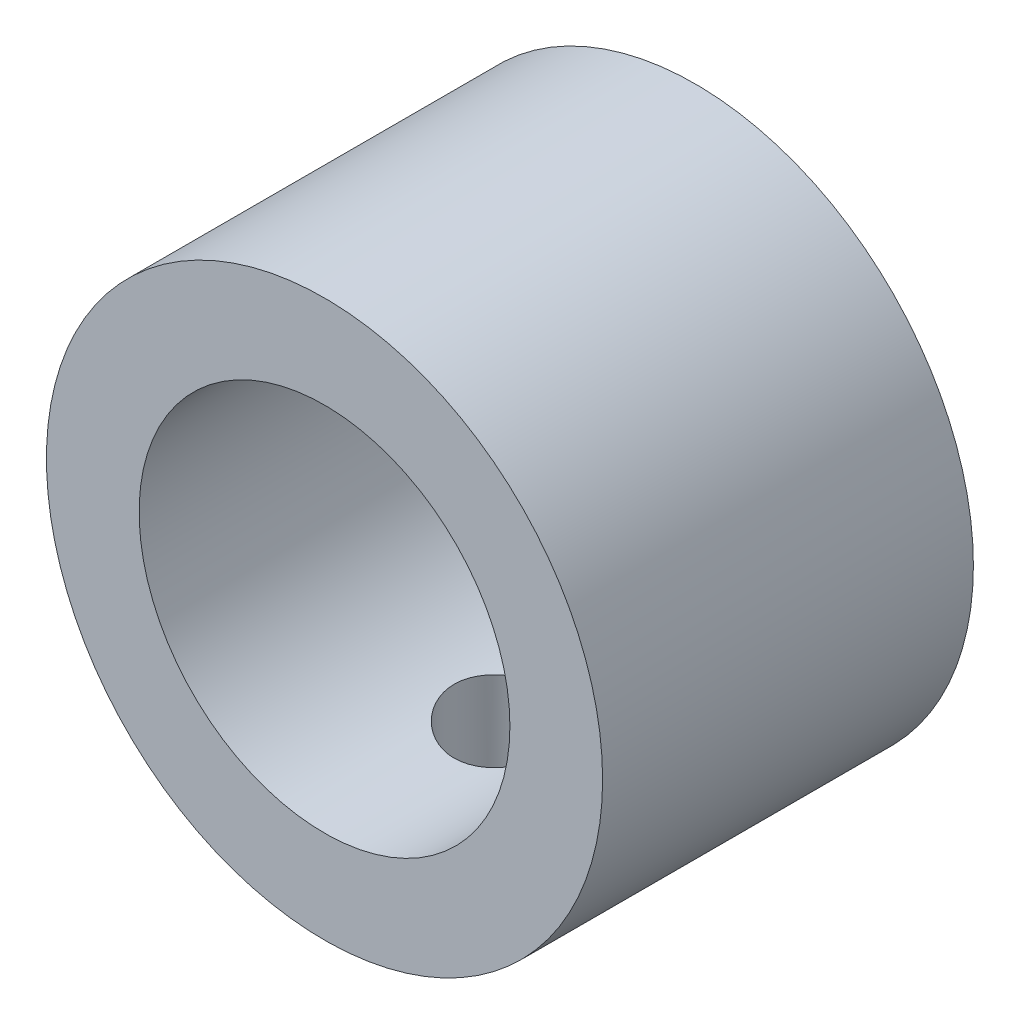
ISO-10303-21;
HEADER;
FILE_DESCRIPTION(('STEP AP214'),'2;1');
FILE_NAME('part.step','',(''),(''),'','','');
FILE_SCHEMA(('AUTOMOTIVE_DESIGN { 1 0 10303 214 1 1 1 1 }'));
ENDSEC;
DATA;
#1=APPLICATION_CONTEXT('core data for automotive mechanical design processes');
#2=APPLICATION_PROTOCOL_DEFINITION('international standard','automotive_design',2000,#1);
#3=PRODUCT_CONTEXT('',#1,'mechanical');
#4=PRODUCT('Part','Part','',(#3));
#5=PRODUCT_RELATED_PRODUCT_CATEGORY('part','',(#4));
#6=PRODUCT_DEFINITION_FORMATION('','',#4);
#7=PRODUCT_DEFINITION_CONTEXT('part definition',#1,'design');
#8=PRODUCT_DEFINITION('design','',#6,#7);
#9=PRODUCT_DEFINITION_SHAPE('','',#8);
#10=(LENGTH_UNIT() NAMED_UNIT(*) SI_UNIT(.MILLI.,.METRE.));
#11=(NAMED_UNIT(*) PLANE_ANGLE_UNIT() SI_UNIT($,.RADIAN.));
#12=(NAMED_UNIT(*) SI_UNIT($,.STERADIAN.) SOLID_ANGLE_UNIT());
#13=UNCERTAINTY_MEASURE_WITH_UNIT(LENGTH_MEASURE(1.E-05),#10,'distance_accuracy_value','');
#14=(GEOMETRIC_REPRESENTATION_CONTEXT(3) GLOBAL_UNCERTAINTY_ASSIGNED_CONTEXT((#13)) GLOBAL_UNIT_ASSIGNED_CONTEXT((#10,
#11,#12)) REPRESENTATION_CONTEXT('',''));
#15=CARTESIAN_POINT('',(0.,0.,0.));
#16=DIRECTION('',(0.,0.,1.));
#17=DIRECTION('',(1.,0.,0.));
#18=AXIS2_PLACEMENT_3D('',#15,#16,#17);
#19=CARTESIAN_POINT('',(0.,0.,5.));
#20=DIRECTION('',(0.,0.,1.));
#21=DIRECTION('',(1.,0.,0.));
#22=AXIS2_PLACEMENT_3D('',#19,#20,#21);
#23=PLANE('',#22);
#24=CARTESIAN_POINT('',(0.,0.,5.));
#25=DIRECTION('',(0.,0.,1.));
#26=DIRECTION('',(1.,0.,0.));
#27=AXIS2_PLACEMENT_3D('',#24,#25,#26);
#28=CIRCLE('',#27,7.5);
#29=CARTESIAN_POINT('',(7.5,0.,5.));
#30=VERTEX_POINT('',#29);
#31=EDGE_CURVE('E10',#30,#30,#28,.T.);
#32=ORIENTED_EDGE('',*,*,#31,.T.);
#33=EDGE_LOOP('',(#32));
#34=FACE_BOUND('',#33,.T.);
#35=CARTESIAN_POINT('',(0.,0.,5.));
#36=DIRECTION('',(0.,0.,1.));
#37=DIRECTION('',(1.,0.,0.));
#38=AXIS2_PLACEMENT_3D('',#35,#36,#37);
#39=CIRCLE('',#38,5.);
#40=CARTESIAN_POINT('',(5.,0.,5.));
#41=VERTEX_POINT('',#40);
#42=EDGE_CURVE('E49',#41,#41,#39,.T.);
#43=ORIENTED_EDGE('',*,*,#42,.F.);
#44=EDGE_LOOP('',(#43));
#45=FACE_BOUND('',#44,.T.);
#46=ADVANCED_FACE('F30',(#34,#45),#23,.T.);
#47=CARTESIAN_POINT('',(0.,0.,-5.));
#48=DIRECTION('',(0.,0.,1.));
#49=DIRECTION('',(1.,0.,0.));
#50=AXIS2_PLACEMENT_3D('',#47,#48,#49);
#51=PLANE('',#50);
#52=CARTESIAN_POINT('',(0.,0.,-5.));
#53=DIRECTION('',(0.,0.,1.));
#54=DIRECTION('',(1.,0.,0.));
#55=AXIS2_PLACEMENT_3D('',#52,#53,#54);
#56=CIRCLE('',#55,7.5);
#57=CARTESIAN_POINT('',(7.5,0.,-5.));
#58=VERTEX_POINT('',#57);
#59=EDGE_CURVE('E44',#58,#58,#56,.T.);
#60=ORIENTED_EDGE('',*,*,#59,.F.);
#61=EDGE_LOOP('',(#60));
#62=FACE_BOUND('',#61,.T.);
#63=CARTESIAN_POINT('',(0.,0.,-5.));
#64=DIRECTION('',(0.,0.,1.));
#65=DIRECTION('',(1.,0.,0.));
#66=AXIS2_PLACEMENT_3D('',#63,#64,#65);
#67=CIRCLE('',#66,5.);
#68=CARTESIAN_POINT('',(5.,0.,-5.));
#69=VERTEX_POINT('',#68);
#70=EDGE_CURVE('E51',#69,#69,#67,.T.);
#71=ORIENTED_EDGE('',*,*,#70,.T.);
#72=EDGE_LOOP('',(#71));
#73=FACE_BOUND('',#72,.T.);
#74=ADVANCED_FACE('F72',(#62,#73),#51,.F.);
#75=CARTESIAN_POINT('',(0.,0.,5.));
#76=DIRECTION('',(0.,0.,-1.));
#77=DIRECTION('',(-1.,0.,0.));
#78=AXIS2_PLACEMENT_3D('',#75,#76,#77);
#79=CYLINDRICAL_SURFACE('',#78,7.5);
#80=CARTESIAN_POINT('',(0.,-7.5,1.5));
#81=CARTESIAN_POINT('',(0.0833653601889498,-7.49999846371307,1.49999693325248));
#82=CARTESIAN_POINT('',(0.166769490302284,-7.49859577767346,1.49302673554853));
#83=CARTESIAN_POINT('',(0.331220261533529,-7.49313548434847,1.46535224982713));
#84=CARTESIAN_POINT('',(0.412264976312034,-7.48907576790279,1.44463705079774));
#85=CARTESIAN_POINT('',(0.569595457894969,-7.4787547391743,1.39013808956882));
#86=CARTESIAN_POINT('',(0.645885701899701,-7.47249553615077,1.35636684473297));
#87=CARTESIAN_POINT('',(0.791711983296338,-7.45845597052971,1.27675162873306));
#88=CARTESIAN_POINT('',(0.861248422613718,-7.4506756985356,1.23090837658919));
#89=CARTESIAN_POINT('',(0.992540215972297,-7.43433247994955,1.12779225856285));
#90=CARTESIAN_POINT('',(1.05419092673779,-7.42576118256521,1.0703874669132));
#91=CARTESIAN_POINT('',(1.16705513491204,-7.40886270678882,0.946061375412447));
#92=CARTESIAN_POINT('',(1.21826781715564,-7.40053554750636,0.879139332997323));
#93=CARTESIAN_POINT('',(1.30924763002143,-7.38498662718923,0.736925710482187));
#94=CARTESIAN_POINT('',(1.3489064082988,-7.37777561047419,0.661563534305461));
#95=CARTESIAN_POINT('',(1.41495849987046,-7.36539402087627,0.505077271493881));
#96=CARTESIAN_POINT('',(1.44135312365586,-7.36022324642942,0.423953754980482));
#97=CARTESIAN_POINT('',(1.47978794982724,-7.35259207878307,0.259373454138124));
#98=CARTESIAN_POINT('',(1.49201174693817,-7.35009705160781,0.175961183786661));
#99=CARTESIAN_POINT('',(1.50232819158918,-7.34799562590941,0.00823526795348636));
#100=CARTESIAN_POINT('',(1.50042228407025,-7.34838893201761,-0.0760782844802178));
#101=CARTESIAN_POINT('',(1.48268185965273,-7.35198826722277,-0.241870182031505));
#102=CARTESIAN_POINT('',(1.46705781036586,-7.35515179288145,-0.323372108440971));
#103=CARTESIAN_POINT('',(1.42265682693458,-7.36386819240002,-0.482574114994503));
#104=CARTESIAN_POINT('',(1.39387926465102,-7.36942118036668,-0.560274013378512));
#105=CARTESIAN_POINT('',(1.32378717551208,-7.38233427750612,-0.710272892555398));
#106=CARTESIAN_POINT('',(1.28238922684817,-7.38970634720557,-0.782531819353757));
#107=CARTESIAN_POINT('',(1.18829036185902,-7.40541928159593,-0.919156274959221));
#108=CARTESIAN_POINT('',(1.13558814653524,-7.41376025757549,-0.983520895276736));
#109=CARTESIAN_POINT('',(1.01924990184088,-7.43065531862193,-1.1037441036854));
#110=CARTESIAN_POINT('',(0.955434241818668,-7.43921053816357,-1.1594288517887));
#111=CARTESIAN_POINT('',(0.819277536093015,-7.45543273071613,-1.25933076945184));
#112=CARTESIAN_POINT('',(0.746936381069084,-7.4630996923346,-1.30354779194037));
#113=CARTESIAN_POINT('',(0.595589080318381,-7.47670035241331,-1.37929126383896));
#114=CARTESIAN_POINT('',(0.51657272937795,-7.48263133272408,-1.41079784046681));
#115=CARTESIAN_POINT('',(0.354223464672997,-7.49207113481787,-1.46004071105785));
#116=CARTESIAN_POINT('',(0.270891075108675,-7.49558025000797,-1.47777867311044));
#117=CARTESIAN_POINT('',(0.103769108440726,-7.49974007800302,-1.49873468069142));
#118=CARTESIAN_POINT('',(0.0200104924883644,-7.50043761978705,-1.5021906293104));
#119=CARTESIAN_POINT('',(-0.146887401289071,-7.49902577895154,-1.49512521158673));
#120=CARTESIAN_POINT('',(-0.23002671366569,-7.49691655412169,-1.48460463097111));
#121=CARTESIAN_POINT('',(-0.392558489919811,-7.49015748012026,-1.45008243968407));
#122=CARTESIAN_POINT('',(-0.471977922509855,-7.4855306460631,-1.42620289725315));
#123=CARTESIAN_POINT('',(-0.625685441249501,-7.47425328091549,-1.36577402601629));
#124=CARTESIAN_POINT('',(-0.699973142456309,-7.4676025982134,-1.32922374798476));
#125=CARTESIAN_POINT('',(-0.842311760529326,-7.45289867299942,-1.24397626402303));
#126=CARTESIAN_POINT('',(-0.910275190128282,-7.44482925655578,-1.19513582844158));
#127=CARTESIAN_POINT('',(-1.03712702867881,-7.42822102244824,-1.08688621318908));
#128=CARTESIAN_POINT('',(-1.09601446339614,-7.41968215452582,-1.0274759004002));
#129=CARTESIAN_POINT('',(-1.20396088616126,-7.40293955335447,-0.898689972163314));
#130=CARTESIAN_POINT('',(-1.25285655367298,-7.39474290349956,-0.829176383667994));
#131=CARTESIAN_POINT('',(-1.33827813007681,-7.37976287694291,-0.682782957964981));
#132=CARTESIAN_POINT('',(-1.37480453388435,-7.37297944370014,-0.605903415639671));
#133=CARTESIAN_POINT('',(-1.43422776237294,-7.36165110876574,-0.447347630775677));
#134=CARTESIAN_POINT('',(-1.45719524968658,-7.3570946230828,-0.365698738184521));
#135=CARTESIAN_POINT('',(-1.48906297744079,-7.35071155188038,-0.199599819763642));
#136=CARTESIAN_POINT('',(-1.49796505233767,-7.34888461036667,-0.115150160685979));
#137=CARTESIAN_POINT('',(-1.5013813663012,-7.34818724447069,0.0525132968164782));
#138=CARTESIAN_POINT('',(-1.49615368210634,-7.34926378783951,0.135721723390514));
#139=CARTESIAN_POINT('',(-1.47202845615009,-7.35413360226921,0.30004747485754));
#140=CARTESIAN_POINT('',(-1.45313102419395,-7.35792685150754,0.381164816542207));
#141=CARTESIAN_POINT('',(-1.40231785274843,-7.36777896328738,0.538841566860818));
#142=CARTESIAN_POINT('',(-1.37043376007602,-7.37383231528246,0.615411540753623));
#143=CARTESIAN_POINT('',(-1.29458196690241,-7.38752572461255,0.762155581101662));
#144=CARTESIAN_POINT('',(-1.25061325316232,-7.39516591498341,0.832329110587706));
#145=CARTESIAN_POINT('',(-1.15095887217962,-7.41133440784838,0.965573358225471));
#146=CARTESIAN_POINT('',(-1.09508683085277,-7.41987559364549,1.02850314790139));
#147=CARTESIAN_POINT('',(-0.973596553519711,-7.43679122807932,1.14417930829376));
#148=CARTESIAN_POINT('',(-0.907976080730003,-7.44516563794777,1.19692333547591));
#149=CARTESIAN_POINT('',(-0.76802644363237,-7.46090748581957,1.29125196591967));
#150=CARTESIAN_POINT('',(-0.693613326644752,-7.46826346828869,1.33271400492004));
#151=CARTESIAN_POINT('',(-0.538749541411099,-7.481026876275,1.40247918389489));
#152=CARTESIAN_POINT('',(-0.458304391294689,-7.48643605707924,1.43079418429874));
#153=CARTESIAN_POINT('',(-0.314732233385669,-7.49364558893056,1.46797792206707));
#154=CARTESIAN_POINT('',(-0.252422496020677,-7.49601454737677,1.47996479056164));
#155=CARTESIAN_POINT('',(-0.1267492878151,-7.49919231209839,1.49597686853755));
#156=CARTESIAN_POINT('',(-0.0633858506229286,-7.50000116809732,1.50000233176465));
#157=CARTESIAN_POINT('',(0.,-7.5,1.5));
#158=B_SPLINE_CURVE_WITH_KNOTS('',3,(#80,#81,#82,#83,#84,#85,#86,#87,#88,#89,#90,#91,#92,#93,
#94,#95,#96,#97,#98,#99,#100,#101,#102,#103,#104,#105,#106,#107,#108,#109,#110,#111,#112,#113,
#114,#115,#116,#117,#118,#119,#120,#121,#122,#123,#124,#125,#126,#127,#128,#129,#130,#131,#132,
#133,#134,#135,#136,#137,#138,#139,#140,#141,#142,#143,#144,#145,#146,#147,#148,#149,#150,#151,
#152,#153,#154,#155,#156,#157),.UNSPECIFIED.,.T.,.F.,(4,2,2,2,2,2,2,2,2,2,2,2,2,2,2,2,2,2,2,2,2,
2,2,2,2,2,2,2,2,2,2,2,2,2,2,2,2,2,4),(0.,0.249864195991888,0.499926976036985,0.749750602875513,
0.999559353346295,1.25239900516828,1.50525839512105,1.76041792508884,2.01555224047796,
2.26734277655381,2.51910756421838,2.76707590509417,3.01505608880594,3.26471235305389,
3.51439732124506,3.76857378737026,4.0227535130973,4.27732912281036,4.53187388547054,
4.78216103514398,5.03243411486801,5.28045680926085,5.52849808824034,5.77957599050038,
6.03068082518895,6.28560942868839,6.540527830852,6.79410571549085,7.04765052495622,
7.29659583851552,7.54553915238913,7.79387941879665,8.042240513728,8.29482114358715,
8.54745981799396,8.80274245013456,9.05779433276278,9.24778162934841,9.43776287056494),.UNSPECIFIED.);
#159=CARTESIAN_POINT('',(0.,-7.5,1.5));
#160=VERTEX_POINT('',#159);
#161=EDGE_CURVE('E54',#160,#160,#158,.T.);
#162=ORIENTED_EDGE('',*,*,#161,.T.);
#163=EDGE_LOOP('',(#162));
#164=FACE_BOUND('',#163,.T.);
#165=ORIENTED_EDGE('',*,*,#31,.F.);
#166=EDGE_LOOP('',(#165));
#167=FACE_BOUND('',#166,.T.);
#168=ORIENTED_EDGE('',*,*,#59,.T.);
#169=EDGE_LOOP('',(#168));
#170=FACE_BOUND('',#169,.T.);
#171=ADVANCED_FACE('F32',(#164,#167,#170),#79,.T.);
#172=CARTESIAN_POINT('',(0.,0.,5.));
#173=DIRECTION('',(0.,0.,-1.));
#174=DIRECTION('',(-1.,0.,0.));
#175=AXIS2_PLACEMENT_3D('',#172,#173,#174);
#176=CYLINDRICAL_SURFACE('',#175,5.);
#177=CARTESIAN_POINT('',(0.,-5.,1.5));
#178=CARTESIAN_POINT('',(0.0822886127533,-4.9999992925055,1.49999900251511));
#179=CARTESIAN_POINT('',(0.164587318351529,-4.99794915693953,1.49320613637603));
#180=CARTESIAN_POINT('',(0.326788125304881,-4.98997105593691,1.4662786457779));
#181=CARTESIAN_POINT('',(0.40668950441142,-4.98404193389692,1.44614004197666));
#182=CARTESIAN_POINT('',(0.561732707754527,-4.96895552501836,1.39325398308974));
#183=CARTESIAN_POINT('',(0.636881364395373,-4.95980300250425,1.36052513038106));
#184=CARTESIAN_POINT('',(0.780624181053131,-4.93922109237645,1.28346390694416));
#185=CARTESIAN_POINT('',(0.849217467469669,-4.92779140192067,1.23912999260458));
#186=CARTESIAN_POINT('',(0.979871797183745,-4.90350737192774,1.13877599252733));
#187=CARTESIAN_POINT('',(1.04171807124434,-4.89062383657036,1.08248337411409));
#188=CARTESIAN_POINT('',(1.15524920923324,-4.86505834210442,0.960390770089816));
#189=CARTESIAN_POINT('',(1.20693236327441,-4.85237641724501,0.89458918787504));
#190=CARTESIAN_POINT('',(1.29980037723708,-4.82834113993772,0.753529246962388));
#191=CARTESIAN_POINT('',(1.34072309022213,-4.81702406663875,0.678091539009262));
#192=CARTESIAN_POINT('',(1.4092139477476,-4.79743620394031,0.521010745769707));
#193=CARTESIAN_POINT('',(1.43678529919973,-4.78916468313311,0.439369156072024));
#194=CARTESIAN_POINT('',(1.47701633682652,-4.77690870838434,0.27460973386954));
#195=CARTESIAN_POINT('',(1.49007196234677,-4.77281069324533,0.191597256136057));
#196=CARTESIAN_POINT('',(1.50213730614672,-4.76902789749767,0.024466843783234));
#197=CARTESIAN_POINT('',(1.50115042761078,-4.76934204760571,-0.0596508180590879));
#198=CARTESIAN_POINT('',(1.48546977199812,-4.77424744067778,-0.223383908608484));
#199=CARTESIAN_POINT('',(1.47127205262685,-4.7786838859914,-0.303052250362239));
#200=CARTESIAN_POINT('',(1.43037420427056,-4.79108356228624,-0.458819786273461));
#201=CARTESIAN_POINT('',(1.40367284141641,-4.7990471413235,-0.534918627374334));
#202=CARTESIAN_POINT('',(1.33816026653682,-4.81772733074973,-0.68260034966074));
#203=CARTESIAN_POINT('',(1.29918816934642,-4.82848016115952,-0.754107083955263));
#204=CARTESIAN_POINT('',(1.21035222588683,-4.85150987000064,-0.889732022010193));
#205=CARTESIAN_POINT('',(1.16048574002588,-4.86378711746991,-0.953848429413778));
#206=CARTESIAN_POINT('',(1.04881290765546,-4.88911011297937,-1.07568619076202));
#207=CARTESIAN_POINT('',(0.986594907466972,-4.90216654310498,-1.13302866402967));
#208=CARTESIAN_POINT('',(0.853263259313966,-4.92712244063258,-1.23655398406425));
#209=CARTESIAN_POINT('',(0.782149051860887,-4.9390218351841,-1.28273612841443));
#210=CARTESIAN_POINT('',(0.632355038342802,-4.9604316006947,-1.36285992246473));
#211=CARTESIAN_POINT('',(0.55362774974795,-4.96992543668314,-1.39671751624986));
#212=CARTESIAN_POINT('',(0.391245415603519,-4.98533521832222,-1.45059959009963));
#213=CARTESIAN_POINT('',(0.307591751589581,-4.99125216186999,-1.47062792853249));
#214=CARTESIAN_POINT('',(0.140952242668331,-4.99868364643538,-1.49565217789939));
#215=CARTESIAN_POINT('',(0.0580500976011864,-5.0003485041779,-1.50116158580161));
#216=CARTESIAN_POINT('',(-0.107499605823384,-4.99952923241759,-1.49843084428792));
#217=CARTESIAN_POINT('',(-0.190147196690781,-4.99704565677756,-1.49019253034856));
#218=CARTESIAN_POINT('',(-0.350903605309697,-4.98830696987163,-1.4606153888885));
#219=CARTESIAN_POINT('',(-0.42907277261417,-4.98213829799417,-1.43957661241913));
#220=CARTESIAN_POINT('',(-0.580754638954522,-4.96674347841532,-1.3853567672218));
#221=CARTESIAN_POINT('',(-0.654266777025584,-4.95751696321085,-1.35217423896214));
#222=CARTESIAN_POINT('',(-0.796437189461053,-4.93669654351325,-1.27374683451887));
#223=CARTESIAN_POINT('',(-0.86494382619967,-4.92505280829675,-1.22824065905203));
#224=CARTESIAN_POINT('',(-0.993523307980147,-4.90073468764317,-1.12677524594719));
#225=CARTESIAN_POINT('',(-1.05359403235593,-4.8880600443108,-1.07081338811233));
#226=CARTESIAN_POINT('',(-1.16585744551027,-4.86253171869138,-0.947612691630654));
#227=CARTESIAN_POINT('',(-1.21768481231504,-4.84968825033268,-0.880038124228263));
#228=CARTESIAN_POINT('',(-1.30928995072154,-4.82576515238463,-0.736872060986467));
#229=CARTESIAN_POINT('',(-1.34906803829472,-4.81468547654651,-0.661280775441785));
#230=CARTESIAN_POINT('',(-1.41517347127168,-4.79567189615055,-0.504467508745311));
#231=CARTESIAN_POINT('',(-1.4415634693705,-4.78772337843827,-0.423273813463408));
#232=CARTESIAN_POINT('',(-1.48021730815114,-4.77591594362794,-0.257312031068522));
#233=CARTESIAN_POINT('',(-1.49248598978779,-4.772055625083,-0.172545179212331));
#234=CARTESIAN_POINT('',(-1.50221984485059,-4.76899972496087,-0.00563848162377213));
#235=CARTESIAN_POINT('',(-1.5002805530849,-4.76961647442754,0.076463651017586));
#236=CARTESIAN_POINT('',(-1.48307505444813,-4.77499401288294,0.2391141033728));
#237=CARTESIAN_POINT('',(-1.46780938124716,-4.77975463592551,0.319662485176354));
#238=CARTESIAN_POINT('',(-1.42476888804136,-4.79275763670385,0.475945399142852));
#239=CARTESIAN_POINT('',(-1.39715175507068,-4.80095604545965,0.551727287361694));
#240=CARTESIAN_POINT('',(-1.33031507121129,-4.81990278909136,0.697642438817724));
#241=CARTESIAN_POINT('',(-1.29109329962876,-4.83065161194312,0.767774617640757));
#242=CARTESIAN_POINT('',(-1.20048763805072,-4.85397676425833,0.903163116527113));
#243=CARTESIAN_POINT('',(-1.14871276092994,-4.86660540163797,0.968148761260412));
#244=CARTESIAN_POINT('',(-1.03517434629782,-4.89201320450026,1.08870249830786));
#245=CARTESIAN_POINT('',(-0.973408217134501,-4.90479240823905,1.14426813946776));
#246=CARTESIAN_POINT('',(-0.839465762183248,-4.92950936570649,1.24602341229503));
#247=CARTESIAN_POINT('',(-0.767037885790607,-4.94141159765674,1.29189144685549));
#248=CARTESIAN_POINT('',(-0.615141373983528,-4.96260680455813,1.37073516990403));
#249=CARTESIAN_POINT('',(-0.535676052998954,-4.97190099931066,1.40371688827451));
#250=CARTESIAN_POINT('',(-0.380757712655281,-4.98602174969301,1.45289527565275));
#251=CARTESIAN_POINT('',(-0.305786961954234,-4.99122027381067,1.47051167288325));
#252=CARTESIAN_POINT('',(-0.153880195230779,-4.99820944494492,1.49406352524158));
#253=CARTESIAN_POINT('',(-0.0769445098581395,-5.0000006615474,1.50000093270482));
#254=CARTESIAN_POINT('',(0.,-5.,1.5));
#255=B_SPLINE_CURVE_WITH_KNOTS('',3,(#177,#178,#179,#180,#181,#182,#183,#184,#185,#186,#187,
#188,#189,#190,#191,#192,#193,#194,#195,#196,#197,#198,#199,#200,#201,#202,#203,#204,#205,#206,
#207,#208,#209,#210,#211,#212,#213,#214,#215,#216,#217,#218,#219,#220,#221,#222,#223,#224,#225,
#226,#227,#228,#229,#230,#231,#232,#233,#234,#235,#236,#237,#238,#239,#240,#241,#242,#243,#244,
#245,#246,#247,#248,#249,#250,#251,#252,#253,#254),.UNSPECIFIED.,.T.,.F.,(4,2,2,2,2,2,2,2,2,2,2,
2,2,2,2,2,2,2,2,2,2,2,2,2,2,2,2,2,2,2,2,2,2,2,2,2,2,2,4),(0.,0.246583203612611,0.493239964846,
0.739533676300874,0.985860164412702,1.23855602948191,1.49129437288633,1.74971481004109,
2.00807314543224,2.25919689356599,2.51025978319089,2.75226016697676,2.99428443658001,
3.2396242644712,3.48502360158555,3.74067104048167,3.99633456531071,4.25371046881689,
4.51101453528808,4.75908809438545,5.00712853550327,5.24956746682327,5.49203554593729,
5.74011305702908,5.98825282000191,6.24540400322818,6.5025484425268,6.75847814951252,
7.01432009460283,7.25950155466943,7.504673196616,7.74680040402721,7.98897397553107,
8.23996925679931,8.49102974897502,8.74942996156671,9.00770911595235,9.23831691930459,
9.46888616948874),.UNSPECIFIED.);
#256=CARTESIAN_POINT('',(0.,-5.,1.5));
#257=VERTEX_POINT('',#256);
#258=EDGE_CURVE('E35',#257,#257,#255,.T.);
#259=ORIENTED_EDGE('',*,*,#258,.F.);
#260=EDGE_LOOP('',(#259));
#261=FACE_BOUND('',#260,.T.);
#262=ORIENTED_EDGE('',*,*,#42,.T.);
#263=EDGE_LOOP('',(#262));
#264=FACE_BOUND('',#263,.T.);
#265=ORIENTED_EDGE('',*,*,#70,.F.);
#266=EDGE_LOOP('',(#265));
#267=FACE_BOUND('',#266,.T.);
#268=ADVANCED_FACE('F64',(#261,#264,#267),#176,.F.);
#269=CARTESIAN_POINT('',(0.,-7.5,0.));
#270=DIRECTION('',(0.,1.,0.));
#271=DIRECTION('',(0.,0.,1.));
#272=AXIS2_PLACEMENT_3D('',#269,#270,#271);
#273=CYLINDRICAL_SURFACE('',#272,1.5);
#274=ORIENTED_EDGE('',*,*,#258,.T.);
#275=EDGE_LOOP('',(#274));
#276=FACE_BOUND('',#275,.T.);
#277=ORIENTED_EDGE('',*,*,#161,.F.);
#278=EDGE_LOOP('',(#277));
#279=FACE_BOUND('',#278,.T.);
#280=ADVANCED_FACE('F61',(#276,#279),#273,.F.);
#281=CLOSED_SHELL('',(#46,#74,#171,#268,#280));
#282=MANIFOLD_SOLID_BREP('B2',#281);
#283=ADVANCED_BREP_SHAPE_REPRESENTATION('',(#18,#282),#14);
#284=SHAPE_DEFINITION_REPRESENTATION(#9,#283);
ENDSEC;
END-ISO-10303-21;
